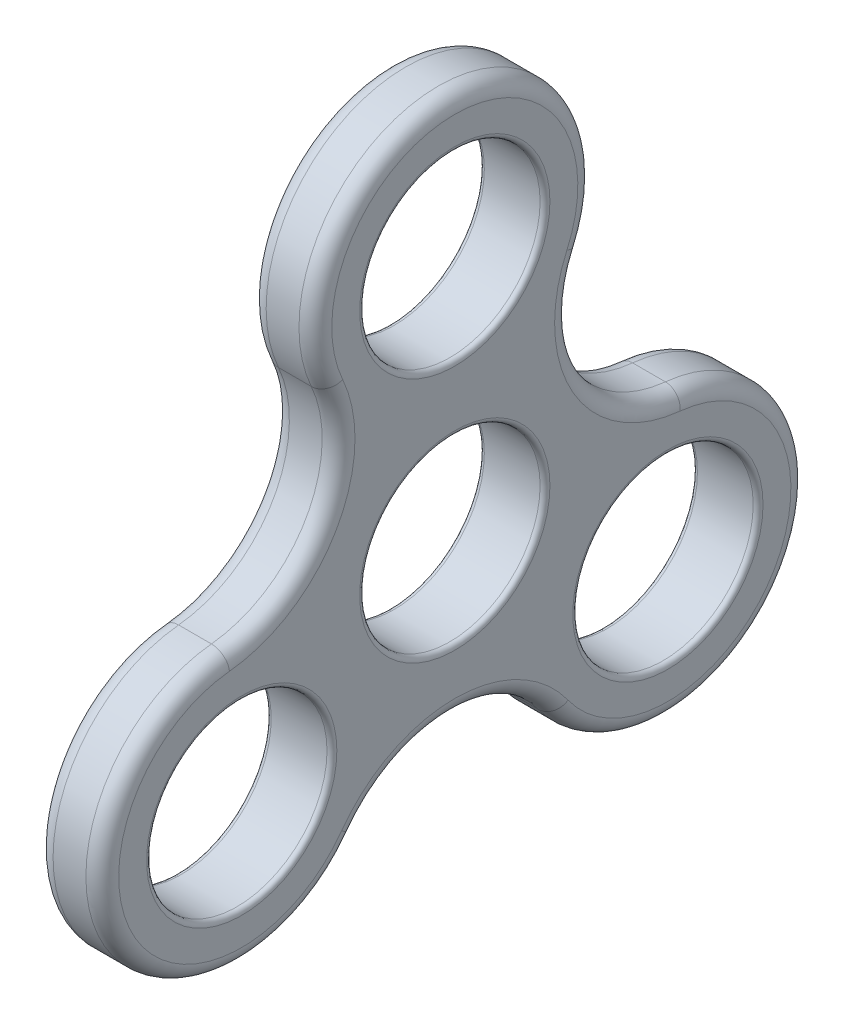
ISO-10303-21;
HEADER;
FILE_DESCRIPTION(('STEP AP214'),'2;1');
FILE_NAME('part.step','',(''),(''),'','','');
FILE_SCHEMA(('AUTOMOTIVE_DESIGN { 1 0 10303 214 1 1 1 1 }'));
ENDSEC;
DATA;
#1=APPLICATION_CONTEXT('core data for automotive mechanical design processes');
#2=APPLICATION_PROTOCOL_DEFINITION('international standard','automotive_design',2000,#1);
#3=PRODUCT_CONTEXT('',#1,'mechanical');
#4=PRODUCT('Part','Part','',(#3));
#5=PRODUCT_RELATED_PRODUCT_CATEGORY('part','',(#4));
#6=PRODUCT_DEFINITION_FORMATION('','',#4);
#7=PRODUCT_DEFINITION_CONTEXT('part definition',#1,'design');
#8=PRODUCT_DEFINITION('design','',#6,#7);
#9=PRODUCT_DEFINITION_SHAPE('','',#8);
#10=(LENGTH_UNIT() NAMED_UNIT(*) SI_UNIT(.MILLI.,.METRE.));
#11=(NAMED_UNIT(*) PLANE_ANGLE_UNIT() SI_UNIT($,.RADIAN.));
#12=(NAMED_UNIT(*) SI_UNIT($,.STERADIAN.) SOLID_ANGLE_UNIT());
#13=UNCERTAINTY_MEASURE_WITH_UNIT(LENGTH_MEASURE(1.E-05),#10,'distance_accuracy_value','');
#14=(GEOMETRIC_REPRESENTATION_CONTEXT(3) GLOBAL_UNCERTAINTY_ASSIGNED_CONTEXT((#13)) GLOBAL_UNIT_ASSIGNED_CONTEXT((#10,
#11,#12)) REPRESENTATION_CONTEXT('',''));
#15=CARTESIAN_POINT('',(0.,0.,0.));
#16=DIRECTION('',(0.,0.,1.));
#17=DIRECTION('',(1.,0.,0.));
#18=AXIS2_PLACEMENT_3D('',#15,#16,#17);
#19=CARTESIAN_POINT('',(4.,30.,0.));
#20=DIRECTION('',(-1.,0.,0.));
#21=DIRECTION('',(0.,0.,1.));
#22=AXIS2_PLACEMENT_3D('',#19,#20,#21);
#23=CYLINDRICAL_SURFACE('',#22,17.);
#24=DIRECTION('',(-1.,0.,0.));
#25=VECTOR('',#24,1.);
#26=CARTESIAN_POINT('',(4.,23.0091595120096,-15.4960688328193));
#27=LINE('',#26,#25);
#28=CARTESIAN_POINT('',(2.,23.0091595120096,-15.4960688328193));
#29=VERTEX_POINT('',#28);
#30=CARTESIAN_POINT('',(-2.,23.0091595120096,-15.4960688328193));
#31=VERTEX_POINT('',#30);
#32=EDGE_CURVE('E374',#29,#31,#27,.T.);
#33=ORIENTED_EDGE('',*,*,#32,.T.);
#34=CARTESIAN_POINT('',(-2.,30.,0.));
#35=DIRECTION('',(1.,0.,0.));
#36=DIRECTION('',(0.,0.,-1.));
#37=AXIS2_PLACEMENT_3D('',#34,#35,#36);
#38=CIRCLE('',#37,17.);
#39=CARTESIAN_POINT('',(-2.,23.0091595120093,15.4960688328192));
#40=VERTEX_POINT('',#39);
#41=EDGE_CURVE('E148',#31,#40,#38,.T.);
#42=ORIENTED_EDGE('',*,*,#41,.T.);
#43=DIRECTION('',(-1.,0.,0.));
#44=VECTOR('',#43,1.);
#45=CARTESIAN_POINT('',(4.,23.0091595120093,15.4960688328192));
#46=LINE('',#45,#44);
#47=CARTESIAN_POINT('',(2.,23.0091595120093,15.4960688328192));
#48=VERTEX_POINT('',#47);
#49=EDGE_CURVE('E130',#48,#40,#46,.T.);
#50=ORIENTED_EDGE('',*,*,#49,.F.);
#51=CARTESIAN_POINT('',(2.,30.,0.));
#52=DIRECTION('',(1.,0.,0.));
#53=DIRECTION('',(0.,0.,-1.));
#54=AXIS2_PLACEMENT_3D('',#51,#52,#53);
#55=CIRCLE('',#54,17.);
#56=EDGE_CURVE('E145',#48,#29,#55,.F.);
#57=ORIENTED_EDGE('',*,*,#56,.T.);
#58=EDGE_LOOP('',(#33,#42,#50,#57));
#59=FACE_BOUND('',#58,.T.);
#60=ADVANCED_FACE('F37',(#59),#23,.T.);
#61=CARTESIAN_POINT('',(4.,16.8407708461351,29.1690707441302));
#62=DIRECTION('',(-1.,0.,0.));
#63=DIRECTION('',(0.,0.,1.));
#64=AXIS2_PLACEMENT_3D('',#61,#62,#63);
#65=CYLINDRICAL_SURFACE('',#64,15.);
#66=ORIENTED_EDGE('',*,*,#49,.T.);
#67=CARTESIAN_POINT('',(-2.,16.8407708461351,29.1690707441302));
#68=DIRECTION('',(1.,0.,0.));
#69=DIRECTION('',(0.,0.,-1.));
#70=AXIS2_PLACEMENT_3D('',#67,#68,#69);
#71=CIRCLE('',#70,15.);
#72=CARTESIAN_POINT('',(-2.,1.91540951200975,27.6745510735374));
#73=VERTEX_POINT('',#72);
#74=EDGE_CURVE('E137',#40,#73,#71,.F.);
#75=ORIENTED_EDGE('',*,*,#74,.T.);
#76=DIRECTION('',(-1.,0.,0.));
#77=VECTOR('',#76,1.);
#78=CARTESIAN_POINT('',(4.,1.91540951200975,27.6745510735374));
#79=LINE('',#78,#77);
#80=CARTESIAN_POINT('',(2.,1.91540951200975,27.6745510735374));
#81=VERTEX_POINT('',#80);
#82=EDGE_CURVE('E132',#81,#73,#79,.T.);
#83=ORIENTED_EDGE('',*,*,#82,.F.);
#84=CARTESIAN_POINT('',(2.,16.8407708461351,29.1690707441302));
#85=DIRECTION('',(1.,0.,0.));
#86=DIRECTION('',(0.,0.,-1.));
#87=AXIS2_PLACEMENT_3D('',#84,#85,#86);
#88=CIRCLE('',#87,15.);
#89=EDGE_CURVE('E127',#81,#48,#88,.T.);
#90=ORIENTED_EDGE('',*,*,#89,.T.);
#91=EDGE_LOOP('',(#66,#75,#83,#90));
#92=FACE_BOUND('',#91,.T.);
#93=ADVANCED_FACE('F129',(#92),#65,.F.);
#94=CARTESIAN_POINT('',(4.,-14.9999999999995,25.9807621135322));
#95=DIRECTION('',(-1.,0.,0.));
#96=DIRECTION('',(0.,0.,1.));
#97=AXIS2_PLACEMENT_3D('',#94,#95,#96);
#98=CYLINDRICAL_SURFACE('',#97,17.0000000000003);
#99=ORIENTED_EDGE('',*,*,#82,.T.);
#100=CARTESIAN_POINT('',(-2.,-14.9999999999995,25.9807621135322));
#101=DIRECTION('',(1.,0.,0.));
#102=DIRECTION('',(0.,0.,-1.));
#103=AXIS2_PLACEMENT_3D('',#100,#101,#102);
#104=CIRCLE('',#103,17.0000000000003);
#105=CARTESIAN_POINT('',(-2.,-24.9245690240179,12.1784822407177));
#106=VERTEX_POINT('',#105);
#107=EDGE_CURVE('E348',#73,#106,#104,.T.);
#108=ORIENTED_EDGE('',*,*,#107,.T.);
#109=DIRECTION('',(-1.,0.,0.));
#110=VECTOR('',#109,1.);
#111=CARTESIAN_POINT('',(4.,-24.9245690240179,12.1784822407177));
#112=LINE('',#111,#110);
#113=CARTESIAN_POINT('',(2.,-24.9245690240179,12.1784822407177));
#114=VERTEX_POINT('',#113);
#115=EDGE_CURVE('E352',#114,#106,#112,.T.);
#116=ORIENTED_EDGE('',*,*,#115,.F.);
#117=CARTESIAN_POINT('',(2.,-14.9999999999995,25.9807621135322));
#118=DIRECTION('',(1.,0.,0.));
#119=DIRECTION('',(0.,0.,-1.));
#120=AXIS2_PLACEMENT_3D('',#117,#118,#119);
#121=CIRCLE('',#120,17.0000000000003);
#122=EDGE_CURVE('E351',#114,#81,#121,.F.);
#123=ORIENTED_EDGE('',*,*,#122,.T.);
#124=EDGE_LOOP('',(#99,#108,#116,#123));
#125=FACE_BOUND('',#124,.T.);
#126=ADVANCED_FACE('F238',(#125),#98,.T.);
#127=CARTESIAN_POINT('',(4.,-33.6815416922692,-6.76108474761961E-13));
#128=DIRECTION('',(-1.,0.,0.));
#129=DIRECTION('',(0.,0.,1.));
#130=AXIS2_PLACEMENT_3D('',#127,#128,#129);
#131=CYLINDRICAL_SURFACE('',#130,15.);
#132=ORIENTED_EDGE('',*,*,#115,.T.);
#133=CARTESIAN_POINT('',(-2.,-33.6815416922692,-6.76108474761961E-13));
#134=DIRECTION('',(1.,0.,0.));
#135=DIRECTION('',(0.,0.,-1.));
#136=AXIS2_PLACEMENT_3D('',#133,#134,#135);
#137=CIRCLE('',#136,15.);
#138=CARTESIAN_POINT('',(-2.,-24.924569024018,-12.1784822407184));
#139=VERTEX_POINT('',#138);
#140=EDGE_CURVE('E411',#106,#139,#137,.F.);
#141=ORIENTED_EDGE('',*,*,#140,.T.);
#142=DIRECTION('',(-1.,0.,0.));
#143=VECTOR('',#142,1.);
#144=CARTESIAN_POINT('',(4.,-24.924569024018,-12.1784822407184));
#145=LINE('',#144,#143);
#146=CARTESIAN_POINT('',(2.,-24.924569024018,-12.1784822407184));
#147=VERTEX_POINT('',#146);
#148=EDGE_CURVE('E382',#147,#139,#145,.T.);
#149=ORIENTED_EDGE('',*,*,#148,.F.);
#150=CARTESIAN_POINT('',(2.,-33.6815416922692,-6.76108474761961E-13));
#151=DIRECTION('',(1.,0.,0.));
#152=DIRECTION('',(0.,0.,-1.));
#153=AXIS2_PLACEMENT_3D('',#150,#151,#152);
#154=CIRCLE('',#153,15.);
#155=EDGE_CURVE('E409',#147,#114,#154,.T.);
#156=ORIENTED_EDGE('',*,*,#155,.T.);
#157=EDGE_LOOP('',(#132,#141,#149,#156));
#158=FACE_BOUND('',#157,.T.);
#159=ADVANCED_FACE('F338',(#158),#131,.F.);
#160=CARTESIAN_POINT('',(4.,-14.9999999999989,-25.9807621135332));
#161=DIRECTION('',(-1.,0.,0.));
#162=DIRECTION('',(0.,0.,1.));
#163=AXIS2_PLACEMENT_3D('',#160,#161,#162);
#164=CYLINDRICAL_SURFACE('',#163,17.0000000000011);
#165=ORIENTED_EDGE('',*,*,#148,.T.);
#166=CARTESIAN_POINT('',(-2.,-14.9999999999989,-25.9807621135332));
#167=DIRECTION('',(1.,0.,0.));
#168=DIRECTION('',(0.,0.,-1.));
#169=AXIS2_PLACEMENT_3D('',#166,#167,#168);
#170=CIRCLE('',#169,17.0000000000011);
#171=CARTESIAN_POINT('',(-2.,1.91540951201094,-27.6745510735381));
#172=VERTEX_POINT('',#171);
#173=EDGE_CURVE('E407',#139,#172,#170,.T.);
#174=ORIENTED_EDGE('',*,*,#173,.T.);
#175=DIRECTION('',(-1.,0.,0.));
#176=VECTOR('',#175,1.);
#177=CARTESIAN_POINT('',(4.,1.91540951201094,-27.6745510735381));
#178=LINE('',#177,#176);
#179=CARTESIAN_POINT('',(2.,1.91540951201094,-27.6745510735381));
#180=VERTEX_POINT('',#179);
#181=EDGE_CURVE('E378',#180,#172,#178,.T.);
#182=ORIENTED_EDGE('',*,*,#181,.F.);
#183=CARTESIAN_POINT('',(2.,-14.9999999999989,-25.9807621135332));
#184=DIRECTION('',(1.,0.,0.));
#185=DIRECTION('',(0.,0.,-1.));
#186=AXIS2_PLACEMENT_3D('',#183,#184,#185);
#187=CIRCLE('',#186,17.0000000000011);
#188=EDGE_CURVE('E405',#180,#147,#187,.F.);
#189=ORIENTED_EDGE('',*,*,#188,.T.);
#190=EDGE_LOOP('',(#165,#174,#182,#189));
#191=FACE_BOUND('',#190,.T.);
#192=ADVANCED_FACE('F331',(#191),#164,.T.);
#193=CARTESIAN_POINT('',(4.,-14.9999999999989,-25.9807621135332));
#194=DIRECTION('',(-1.,0.,0.));
#195=DIRECTION('',(0.,0.,1.));
#196=AXIS2_PLACEMENT_3D('',#193,#194,#195);
#197=CYLINDRICAL_SURFACE('',#196,11.0000000000012);
#198=CARTESIAN_POINT('',(-3.4,-14.9999999999989,-25.9807621135332));
#199=DIRECTION('',(1.,0.,0.));
#200=DIRECTION('',(0.,0.,-1.));
#201=AXIS2_PLACEMENT_3D('',#198,#199,#200);
#202=CIRCLE('',#201,11.0000000000012);
#203=CARTESIAN_POINT('',(-3.4,-14.9999999999989,-36.9807621135344));
#204=VERTEX_POINT('',#203);
#205=EDGE_CURVE('E211',#204,#204,#202,.F.);
#206=ORIENTED_EDGE('',*,*,#205,.T.);
#207=EDGE_LOOP('',(#206));
#208=FACE_BOUND('',#207,.T.);
#209=CARTESIAN_POINT('',(3.4,-14.9999999999989,-25.9807621135332));
#210=DIRECTION('',(1.,0.,0.));
#211=DIRECTION('',(0.,0.,-1.));
#212=AXIS2_PLACEMENT_3D('',#209,#210,#211);
#213=CIRCLE('',#212,11.0000000000012);
#214=CARTESIAN_POINT('',(3.4,-14.9999999999989,-36.9807621135344));
#215=VERTEX_POINT('',#214);
#216=EDGE_CURVE('E208',#215,#215,#213,.T.);
#217=ORIENTED_EDGE('',*,*,#216,.T.);
#218=EDGE_LOOP('',(#217));
#219=FACE_BOUND('',#218,.T.);
#220=ADVANCED_FACE('F322',(#208,#219),#197,.F.);
#221=CARTESIAN_POINT('',(4.,0.,0.));
#222=DIRECTION('',(-1.,0.,0.));
#223=DIRECTION('',(0.,0.,1.));
#224=AXIS2_PLACEMENT_3D('',#221,#222,#223);
#225=CYLINDRICAL_SURFACE('',#224,11.);
#226=CARTESIAN_POINT('',(-3.4,0.,0.));
#227=DIRECTION('',(1.,0.,0.));
#228=DIRECTION('',(0.,0.,-1.));
#229=AXIS2_PLACEMENT_3D('',#226,#227,#228);
#230=CIRCLE('',#229,11.);
#231=CARTESIAN_POINT('',(-3.4,0.,-11.));
#232=VERTEX_POINT('',#231);
#233=EDGE_CURVE('E217',#232,#232,#230,.F.);
#234=ORIENTED_EDGE('',*,*,#233,.T.);
#235=EDGE_LOOP('',(#234));
#236=FACE_BOUND('',#235,.T.);
#237=CARTESIAN_POINT('',(3.4,0.,0.));
#238=DIRECTION('',(1.,0.,0.));
#239=DIRECTION('',(0.,0.,-1.));
#240=AXIS2_PLACEMENT_3D('',#237,#238,#239);
#241=CIRCLE('',#240,11.);
#242=CARTESIAN_POINT('',(3.4,0.,-11.));
#243=VERTEX_POINT('',#242);
#244=EDGE_CURVE('E214',#243,#243,#241,.T.);
#245=ORIENTED_EDGE('',*,*,#244,.T.);
#246=EDGE_LOOP('',(#245));
#247=FACE_BOUND('',#246,.T.);
#248=ADVANCED_FACE('F320',(#236,#247),#225,.F.);
#249=CARTESIAN_POINT('',(4.,16.8407708461358,-29.1690707441305));
#250=DIRECTION('',(-1.,0.,0.));
#251=DIRECTION('',(0.,0.,1.));
#252=AXIS2_PLACEMENT_3D('',#249,#250,#251);
#253=CYLINDRICAL_SURFACE('',#252,15.);
#254=ORIENTED_EDGE('',*,*,#181,.T.);
#255=CARTESIAN_POINT('',(-2.,16.8407708461358,-29.1690707441305));
#256=DIRECTION('',(1.,0.,0.));
#257=DIRECTION('',(0.,0.,-1.));
#258=AXIS2_PLACEMENT_3D('',#255,#256,#257);
#259=CIRCLE('',#258,15.);
#260=EDGE_CURVE('E403',#172,#31,#259,.F.);
#261=ORIENTED_EDGE('',*,*,#260,.T.);
#262=ORIENTED_EDGE('',*,*,#32,.F.);
#263=CARTESIAN_POINT('',(2.,16.8407708461358,-29.1690707441305));
#264=DIRECTION('',(1.,0.,0.));
#265=DIRECTION('',(0.,0.,-1.));
#266=AXIS2_PLACEMENT_3D('',#263,#264,#265);
#267=CIRCLE('',#266,15.);
#268=EDGE_CURVE('E401',#29,#180,#267,.T.);
#269=ORIENTED_EDGE('',*,*,#268,.T.);
#270=EDGE_LOOP('',(#254,#261,#262,#269));
#271=FACE_BOUND('',#270,.T.);
#272=ADVANCED_FACE('F245',(#271),#253,.F.);
#273=CARTESIAN_POINT('',(4.,30.,0.));
#274=DIRECTION('',(-1.,0.,0.));
#275=DIRECTION('',(0.,0.,1.));
#276=AXIS2_PLACEMENT_3D('',#273,#274,#275);
#277=CYLINDRICAL_SURFACE('',#276,11.);
#278=CARTESIAN_POINT('',(-3.4,30.,0.));
#279=DIRECTION('',(1.,0.,0.));
#280=DIRECTION('',(0.,0.,-1.));
#281=AXIS2_PLACEMENT_3D('',#278,#279,#280);
#282=CIRCLE('',#281,11.);
#283=CARTESIAN_POINT('',(-3.4,30.,-11.));
#284=VERTEX_POINT('',#283);
#285=EDGE_CURVE('E11',#284,#284,#282,.F.);
#286=ORIENTED_EDGE('',*,*,#285,.T.);
#287=EDGE_LOOP('',(#286));
#288=FACE_BOUND('',#287,.T.);
#289=CARTESIAN_POINT('',(3.4,30.,0.));
#290=DIRECTION('',(1.,0.,0.));
#291=DIRECTION('',(0.,0.,-1.));
#292=AXIS2_PLACEMENT_3D('',#289,#290,#291);
#293=CIRCLE('',#292,11.);
#294=CARTESIAN_POINT('',(3.4,30.,-11.));
#295=VERTEX_POINT('',#294);
#296=EDGE_CURVE('E45',#295,#295,#293,.T.);
#297=ORIENTED_EDGE('',*,*,#296,.T.);
#298=EDGE_LOOP('',(#297));
#299=FACE_BOUND('',#298,.T.);
#300=ADVANCED_FACE('F222',(#288,#299),#277,.F.);
#301=CARTESIAN_POINT('',(4.,-14.9999999999995,25.9807621135322));
#302=DIRECTION('',(-1.,0.,0.));
#303=DIRECTION('',(0.,0.,1.));
#304=AXIS2_PLACEMENT_3D('',#301,#302,#303);
#305=CYLINDRICAL_SURFACE('',#304,11.0000000000006);
#306=CARTESIAN_POINT('',(-3.4,-14.9999999999995,25.9807621135322));
#307=DIRECTION('',(1.,0.,0.));
#308=DIRECTION('',(0.,0.,-1.));
#309=AXIS2_PLACEMENT_3D('',#306,#307,#308);
#310=CIRCLE('',#309,11.0000000000006);
#311=CARTESIAN_POINT('',(-3.4,-14.9999999999995,14.9807621135316));
#312=VERTEX_POINT('',#311);
#313=EDGE_CURVE('E193',#312,#312,#310,.F.);
#314=ORIENTED_EDGE('',*,*,#313,.T.);
#315=EDGE_LOOP('',(#314));
#316=FACE_BOUND('',#315,.T.);
#317=CARTESIAN_POINT('',(3.4,-14.9999999999995,25.9807621135322));
#318=DIRECTION('',(1.,0.,0.));
#319=DIRECTION('',(0.,0.,-1.));
#320=AXIS2_PLACEMENT_3D('',#317,#318,#319);
#321=CIRCLE('',#320,11.0000000000006);
#322=CARTESIAN_POINT('',(3.4,-14.9999999999995,14.9807621135316));
#323=VERTEX_POINT('',#322);
#324=EDGE_CURVE('E190',#323,#323,#321,.T.);
#325=ORIENTED_EDGE('',*,*,#324,.T.);
#326=EDGE_LOOP('',(#325));
#327=FACE_BOUND('',#326,.T.);
#328=ADVANCED_FACE('F244',(#316,#327),#305,.F.);
#329=CARTESIAN_POINT('',(4.,0.,0.));
#330=DIRECTION('',(1.,0.,0.));
#331=DIRECTION('',(0.,0.,-1.));
#332=AXIS2_PLACEMENT_3D('',#329,#330,#331);
#333=PLANE('',#332);
#334=CARTESIAN_POINT('',(4.,-14.9999999999995,25.9807621135322));
#335=DIRECTION('',(1.,0.,0.));
#336=DIRECTION('',(0.,0.,-1.));
#337=AXIS2_PLACEMENT_3D('',#334,#335,#336);
#338=CIRCLE('',#337,11.6000000000006);
#339=CARTESIAN_POINT('',(4.,-14.9999999999995,14.3807621135316));
#340=VERTEX_POINT('',#339);
#341=EDGE_CURVE('E205',#340,#340,#338,.F.);
#342=ORIENTED_EDGE('',*,*,#341,.T.);
#343=EDGE_LOOP('',(#342));
#344=FACE_BOUND('',#343,.T.);
#345=CARTESIAN_POINT('',(4.,-14.9999999999989,-25.9807621135332));
#346=DIRECTION('',(1.,0.,0.));
#347=DIRECTION('',(0.,0.,-1.));
#348=AXIS2_PLACEMENT_3D('',#345,#346,#347);
#349=CIRCLE('',#348,11.6000000000012);
#350=CARTESIAN_POINT('',(4.,-14.9999999999989,-37.5807621135344));
#351=VERTEX_POINT('',#350);
#352=EDGE_CURVE('E202',#351,#351,#349,.F.);
#353=ORIENTED_EDGE('',*,*,#352,.T.);
#354=EDGE_LOOP('',(#353));
#355=FACE_BOUND('',#354,.T.);
#356=CARTESIAN_POINT('',(4.,0.,0.));
#357=DIRECTION('',(1.,0.,0.));
#358=DIRECTION('',(0.,0.,-1.));
#359=AXIS2_PLACEMENT_3D('',#356,#357,#358);
#360=CIRCLE('',#359,11.6);
#361=CARTESIAN_POINT('',(4.,0.,-11.6));
#362=VERTEX_POINT('',#361);
#363=EDGE_CURVE('E199',#362,#362,#360,.F.);
#364=ORIENTED_EDGE('',*,*,#363,.T.);
#365=EDGE_LOOP('',(#364));
#366=FACE_BOUND('',#365,.T.);
#367=CARTESIAN_POINT('',(4.,30.,0.));
#368=DIRECTION('',(1.,0.,0.));
#369=DIRECTION('',(0.,0.,-1.));
#370=AXIS2_PLACEMENT_3D('',#367,#368,#369);
#371=CIRCLE('',#370,11.6);
#372=CARTESIAN_POINT('',(4.,30.,-11.6));
#373=VERTEX_POINT('',#372);
#374=EDGE_CURVE('E196',#373,#373,#371,.F.);
#375=ORIENTED_EDGE('',*,*,#374,.T.);
#376=EDGE_LOOP('',(#375));
#377=FACE_BOUND('',#376,.T.);
#378=CARTESIAN_POINT('',(4.,16.8407708461358,-29.1690707441305));
#379=DIRECTION('',(1.,0.,0.));
#380=DIRECTION('',(0.,0.,-1.));
#381=AXIS2_PLACEMENT_3D('',#378,#379,#380);
#382=CIRCLE('',#381,17.);
#383=CARTESIAN_POINT('',(4.,-0.0746386658721831,-27.4752817841258));
#384=VERTEX_POINT('',#383);
#385=CARTESIAN_POINT('',(4.,23.8316113341261,-13.6730019113112));
#386=VERTEX_POINT('',#385);
#387=EDGE_CURVE('E52',#384,#386,#382,.F.);
#388=ORIENTED_EDGE('',*,*,#387,.T.);
#389=CARTESIAN_POINT('',(4.,30.,0.));
#390=DIRECTION('',(1.,0.,0.));
#391=DIRECTION('',(0.,0.,-1.));
#392=AXIS2_PLACEMENT_3D('',#389,#390,#391);
#393=CIRCLE('',#392,15.);
#394=CARTESIAN_POINT('',(4.,23.8316113341258,13.673001911311));
#395=VERTEX_POINT('',#394);
#396=EDGE_CURVE('E138',#386,#395,#393,.T.);
#397=ORIENTED_EDGE('',*,*,#396,.T.);
#398=CARTESIAN_POINT('',(4.,16.8407708461351,29.1690707441302));
#399=DIRECTION('',(1.,0.,0.));
#400=DIRECTION('',(0.,0.,-1.));
#401=AXIS2_PLACEMENT_3D('',#398,#399,#400);
#402=CIRCLE('',#401,17.);
#403=CARTESIAN_POINT('',(4.,-0.074638665873869,27.475281784125));
#404=VERTEX_POINT('',#403);
#405=EDGE_CURVE('E159',#395,#404,#402,.F.);
#406=ORIENTED_EDGE('',*,*,#405,.T.);
#407=CARTESIAN_POINT('',(4.,-14.9999999999995,25.9807621135322));
#408=DIRECTION('',(1.,0.,0.));
#409=DIRECTION('',(0.,0.,-1.));
#410=AXIS2_PLACEMENT_3D('',#407,#408,#409);
#411=CIRCLE('',#410,15.0000000000003);
#412=CARTESIAN_POINT('',(4.,-23.7569726682511,13.8022798728134));
#413=VERTEX_POINT('',#412);
#414=EDGE_CURVE('E415',#404,#413,#411,.T.);
#415=ORIENTED_EDGE('',*,*,#414,.T.);
#416=CARTESIAN_POINT('',(4.,-33.6815416922692,-6.76108474761961E-13));
#417=DIRECTION('',(1.,0.,0.));
#418=DIRECTION('',(0.,0.,-1.));
#419=AXIS2_PLACEMENT_3D('',#416,#417,#418);
#420=CIRCLE('',#419,17.);
#421=CARTESIAN_POINT('',(4.,-23.7569726682506,-13.8022798728148));
#422=VERTEX_POINT('',#421);
#423=EDGE_CURVE('E417',#413,#422,#420,.F.);
#424=ORIENTED_EDGE('',*,*,#423,.T.);
#425=CARTESIAN_POINT('',(4.,-14.9999999999989,-25.9807621135332));
#426=DIRECTION('',(1.,0.,0.));
#427=DIRECTION('',(0.,0.,-1.));
#428=AXIS2_PLACEMENT_3D('',#425,#426,#427);
#429=CIRCLE('',#428,15.0000000000011);
#430=EDGE_CURVE('E57',#422,#384,#429,.T.);
#431=ORIENTED_EDGE('',*,*,#430,.T.);
#432=EDGE_LOOP('',(#388,#397,#406,#415,#424,#431));
#433=FACE_BOUND('',#432,.T.);
#434=ADVANCED_FACE('F432',(#344,#355,#366,#377,#433),#333,.T.);
#435=CARTESIAN_POINT('',(-4.,0.,0.));
#436=DIRECTION('',(1.,0.,0.));
#437=DIRECTION('',(0.,0.,-1.));
#438=AXIS2_PLACEMENT_3D('',#435,#436,#437);
#439=PLANE('',#438);
#440=CARTESIAN_POINT('',(-4.,-14.9999999999995,25.9807621135322));
#441=DIRECTION('',(1.,0.,0.));
#442=DIRECTION('',(0.,0.,-1.));
#443=AXIS2_PLACEMENT_3D('',#440,#441,#442);
#444=CIRCLE('',#443,11.6000000000006);
#445=CARTESIAN_POINT('',(-4.,-14.9999999999995,14.3807621135316));
#446=VERTEX_POINT('',#445);
#447=EDGE_CURVE('E187',#446,#446,#444,.T.);
#448=ORIENTED_EDGE('',*,*,#447,.T.);
#449=EDGE_LOOP('',(#448));
#450=FACE_BOUND('',#449,.T.);
#451=CARTESIAN_POINT('',(-4.,-14.9999999999989,-25.9807621135332));
#452=DIRECTION('',(1.,0.,0.));
#453=DIRECTION('',(0.,0.,-1.));
#454=AXIS2_PLACEMENT_3D('',#451,#452,#453);
#455=CIRCLE('',#454,11.6000000000012);
#456=CARTESIAN_POINT('',(-4.,-14.9999999999989,-37.5807621135344));
#457=VERTEX_POINT('',#456);
#458=EDGE_CURVE('E184',#457,#457,#455,.T.);
#459=ORIENTED_EDGE('',*,*,#458,.T.);
#460=EDGE_LOOP('',(#459));
#461=FACE_BOUND('',#460,.T.);
#462=CARTESIAN_POINT('',(-4.,0.,0.));
#463=DIRECTION('',(1.,0.,0.));
#464=DIRECTION('',(0.,0.,-1.));
#465=AXIS2_PLACEMENT_3D('',#462,#463,#464);
#466=CIRCLE('',#465,11.6);
#467=CARTESIAN_POINT('',(-4.,0.,-11.6));
#468=VERTEX_POINT('',#467);
#469=EDGE_CURVE('E181',#468,#468,#466,.T.);
#470=ORIENTED_EDGE('',*,*,#469,.T.);
#471=EDGE_LOOP('',(#470));
#472=FACE_BOUND('',#471,.T.);
#473=CARTESIAN_POINT('',(-4.,30.,0.));
#474=DIRECTION('',(1.,0.,0.));
#475=DIRECTION('',(0.,0.,-1.));
#476=AXIS2_PLACEMENT_3D('',#473,#474,#475);
#477=CIRCLE('',#476,11.6);
#478=CARTESIAN_POINT('',(-4.,30.,-11.6));
#479=VERTEX_POINT('',#478);
#480=EDGE_CURVE('E178',#479,#479,#477,.T.);
#481=ORIENTED_EDGE('',*,*,#480,.T.);
#482=EDGE_LOOP('',(#481));
#483=FACE_BOUND('',#482,.T.);
#484=CARTESIAN_POINT('',(-4.,16.8407708461351,29.1690707441302));
#485=DIRECTION('',(1.,0.,0.));
#486=DIRECTION('',(0.,0.,-1.));
#487=AXIS2_PLACEMENT_3D('',#484,#485,#486);
#488=CIRCLE('',#487,17.);
#489=CARTESIAN_POINT('',(-4.,-0.0746386658738708,27.475281784125));
#490=VERTEX_POINT('',#489);
#491=CARTESIAN_POINT('',(-4.,23.8316113341258,13.673001911311));
#492=VERTEX_POINT('',#491);
#493=EDGE_CURVE('E365',#490,#492,#488,.T.);
#494=ORIENTED_EDGE('',*,*,#493,.T.);
#495=CARTESIAN_POINT('',(-4.,30.,0.));
#496=DIRECTION('',(1.,0.,0.));
#497=DIRECTION('',(0.,0.,-1.));
#498=AXIS2_PLACEMENT_3D('',#495,#496,#497);
#499=CIRCLE('',#498,15.);
#500=CARTESIAN_POINT('',(-4.,23.8316113341261,-13.6730019113112));
#501=VERTEX_POINT('',#500);
#502=EDGE_CURVE('E398',#492,#501,#499,.F.);
#503=ORIENTED_EDGE('',*,*,#502,.T.);
#504=CARTESIAN_POINT('',(-4.,16.8407708461358,-29.1690707441305));
#505=DIRECTION('',(1.,0.,0.));
#506=DIRECTION('',(0.,0.,-1.));
#507=AXIS2_PLACEMENT_3D('',#504,#505,#506);
#508=CIRCLE('',#507,17.);
#509=CARTESIAN_POINT('',(-4.,-0.0746386658721832,-27.4752817841258));
#510=VERTEX_POINT('',#509);
#511=EDGE_CURVE('E396',#501,#510,#508,.T.);
#512=ORIENTED_EDGE('',*,*,#511,.T.);
#513=CARTESIAN_POINT('',(-4.,-14.9999999999989,-25.9807621135332));
#514=DIRECTION('',(1.,0.,0.));
#515=DIRECTION('',(0.,0.,-1.));
#516=AXIS2_PLACEMENT_3D('',#513,#514,#515);
#517=CIRCLE('',#516,15.0000000000011);
#518=CARTESIAN_POINT('',(-4.,-23.7569726682506,-13.8022798728148));
#519=VERTEX_POINT('',#518);
#520=EDGE_CURVE('E394',#510,#519,#517,.F.);
#521=ORIENTED_EDGE('',*,*,#520,.T.);
#522=CARTESIAN_POINT('',(-4.,-33.6815416922692,-6.76108474761961E-13));
#523=DIRECTION('',(1.,0.,0.));
#524=DIRECTION('',(0.,0.,-1.));
#525=AXIS2_PLACEMENT_3D('',#522,#523,#524);
#526=CIRCLE('',#525,17.);
#527=CARTESIAN_POINT('',(-4.,-23.7569726682511,13.8022798728134));
#528=VERTEX_POINT('',#527);
#529=EDGE_CURVE('E392',#519,#528,#526,.T.);
#530=ORIENTED_EDGE('',*,*,#529,.T.);
#531=CARTESIAN_POINT('',(-4.,-14.9999999999995,25.9807621135322));
#532=DIRECTION('',(1.,0.,0.));
#533=DIRECTION('',(0.,0.,-1.));
#534=AXIS2_PLACEMENT_3D('',#531,#532,#533);
#535=CIRCLE('',#534,15.0000000000003);
#536=EDGE_CURVE('E390',#528,#490,#535,.F.);
#537=ORIENTED_EDGE('',*,*,#536,.T.);
#538=EDGE_LOOP('',(#494,#503,#512,#521,#530,#537));
#539=FACE_BOUND('',#538,.T.);
#540=ADVANCED_FACE('F271',(#450,#461,#472,#483,#539),#439,.F.);
#541=CARTESIAN_POINT('',(-2.,-33.6815416922692,-6.76108474761961E-13));
#542=DIRECTION('',(1.,0.,0.));
#543=DIRECTION('',(0.,0.,-1.));
#544=AXIS2_PLACEMENT_3D('',#541,#542,#543);
#545=TOROIDAL_SURFACE('',#544,17.,2.);
#546=CARTESIAN_POINT('',(-2.,-23.7569726682509,13.8022798728137));
#547=DIRECTION('',(0.,-0.811898816047903,0.58379817788343));
#548=DIRECTION('',(0.,-0.58379817788343,-0.811898816047903));
#549=AXIS2_PLACEMENT_3D('',#546,#547,#548);
#550=CIRCLE('',#549,2.);
#551=EDGE_CURVE('E361',#528,#106,#550,.T.);
#552=ORIENTED_EDGE('',*,*,#551,.F.);
#553=ORIENTED_EDGE('',*,*,#529,.F.);
#554=CARTESIAN_POINT('',(-2.,-23.7569726682506,-13.8022798728148));
#555=DIRECTION('',(0.,-0.81189881604789,-0.583798177883449));
#556=DIRECTION('',(0.,0.583798177883449,-0.81189881604789));
#557=AXIS2_PLACEMENT_3D('',#554,#555,#556);
#558=CIRCLE('',#557,2.);
#559=EDGE_CURVE('E164',#139,#519,#558,.T.);
#560=ORIENTED_EDGE('',*,*,#559,.F.);
#561=ORIENTED_EDGE('',*,*,#140,.F.);
#562=EDGE_LOOP('',(#552,#553,#560,#561));
#563=FACE_BOUND('',#562,.T.);
#564=ADVANCED_FACE('F267',(#563),#545,.T.);
#565=CARTESIAN_POINT('',(-2.,-14.9999999999989,-25.9807621135332));
#566=DIRECTION('',(1.,0.,0.));
#567=DIRECTION('',(0.,0.,-1.));
#568=AXIS2_PLACEMENT_3D('',#565,#566,#567);
#569=TOROIDAL_SURFACE('',#568,15.0000000000011,2.);
#570=ORIENTED_EDGE('',*,*,#559,.T.);
#571=ORIENTED_EDGE('',*,*,#520,.F.);
#572=CARTESIAN_POINT('',(-2.,-0.0746386658721848,-27.4752817841258));
#573=DIRECTION('',(0.,0.0996346447061664,0.995024088941708));
#574=DIRECTION('',(0.,-0.995024088941708,0.0996346447061664));
#575=AXIS2_PLACEMENT_3D('',#572,#573,#574);
#576=CIRCLE('',#575,2.);
#577=EDGE_CURVE('E366',#172,#510,#576,.T.);
#578=ORIENTED_EDGE('',*,*,#577,.F.);
#579=ORIENTED_EDGE('',*,*,#173,.F.);
#580=EDGE_LOOP('',(#570,#571,#578,#579));
#581=FACE_BOUND('',#580,.T.);
#582=ADVANCED_FACE('F263',(#581),#569,.T.);
#583=CARTESIAN_POINT('',(-2.,-14.9999999999995,25.9807621135322));
#584=DIRECTION('',(1.,0.,0.));
#585=DIRECTION('',(0.,0.,-1.));
#586=AXIS2_PLACEMENT_3D('',#583,#584,#585);
#587=TOROIDAL_SURFACE('',#586,15.0000000000003,2.);
#588=ORIENTED_EDGE('',*,*,#551,.T.);
#589=ORIENTED_EDGE('',*,*,#107,.F.);
#590=CARTESIAN_POINT('',(-2.,-0.0746386658735843,27.4752817841251));
#591=DIRECTION('',(0.,0.0996346447061871,-0.995024088941706));
#592=DIRECTION('',(0.,0.995024088941706,0.0996346447061871));
#593=AXIS2_PLACEMENT_3D('',#590,#591,#592);
#594=CIRCLE('',#593,2.);
#595=EDGE_CURVE('E358',#490,#73,#594,.T.);
#596=ORIENTED_EDGE('',*,*,#595,.F.);
#597=ORIENTED_EDGE('',*,*,#536,.F.);
#598=EDGE_LOOP('',(#588,#589,#596,#597));
#599=FACE_BOUND('',#598,.T.);
#600=ADVANCED_FACE('F259',(#599),#587,.T.);
#601=CARTESIAN_POINT('',(-2.,16.8407708461358,-29.1690707441305));
#602=DIRECTION('',(1.,0.,0.));
#603=DIRECTION('',(0.,0.,-1.));
#604=AXIS2_PLACEMENT_3D('',#601,#602,#603);
#605=TOROIDAL_SURFACE('',#604,17.,2.);
#606=ORIENTED_EDGE('',*,*,#577,.T.);
#607=ORIENTED_EDGE('',*,*,#511,.F.);
#608=CARTESIAN_POINT('',(-2.,23.8316113341261,-13.6730019113112));
#609=DIRECTION('',(0.,0.911533460754078,-0.411225911058258));
#610=DIRECTION('',(0.,0.411225911058258,0.911533460754078));
#611=AXIS2_PLACEMENT_3D('',#608,#609,#610);
#612=CIRCLE('',#611,2.);
#613=EDGE_CURVE('E367',#31,#501,#612,.T.);
#614=ORIENTED_EDGE('',*,*,#613,.F.);
#615=ORIENTED_EDGE('',*,*,#260,.F.);
#616=EDGE_LOOP('',(#606,#607,#614,#615));
#617=FACE_BOUND('',#616,.T.);
#618=ADVANCED_FACE('F255',(#617),#605,.T.);
#619=CARTESIAN_POINT('',(-2.,16.8407708461351,29.1690707441302));
#620=DIRECTION('',(1.,0.,0.));
#621=DIRECTION('',(0.,0.,-1.));
#622=AXIS2_PLACEMENT_3D('',#619,#620,#621);
#623=TOROIDAL_SURFACE('',#622,17.,2.);
#624=ORIENTED_EDGE('',*,*,#595,.T.);
#625=ORIENTED_EDGE('',*,*,#74,.F.);
#626=CARTESIAN_POINT('',(-2.,23.8316113341258,13.673001911311));
#627=DIRECTION('',(0.,0.911533460754069,0.411225911058276));
#628=DIRECTION('',(0.,-0.411225911058277,0.911533460754069));
#629=AXIS2_PLACEMENT_3D('',#626,#627,#628);
#630=CIRCLE('',#629,2.);
#631=EDGE_CURVE('E177',#492,#40,#630,.T.);
#632=ORIENTED_EDGE('',*,*,#631,.F.);
#633=ORIENTED_EDGE('',*,*,#493,.F.);
#634=EDGE_LOOP('',(#624,#625,#632,#633));
#635=FACE_BOUND('',#634,.T.);
#636=ADVANCED_FACE('F251',(#635),#623,.T.);
#637=CARTESIAN_POINT('',(-2.,30.,0.));
#638=DIRECTION('',(1.,0.,0.));
#639=DIRECTION('',(0.,0.,-1.));
#640=AXIS2_PLACEMENT_3D('',#637,#638,#639);
#641=TOROIDAL_SURFACE('',#640,15.,2.);
#642=ORIENTED_EDGE('',*,*,#613,.T.);
#643=ORIENTED_EDGE('',*,*,#502,.F.);
#644=ORIENTED_EDGE('',*,*,#631,.T.);
#645=ORIENTED_EDGE('',*,*,#41,.F.);
#646=EDGE_LOOP('',(#642,#643,#644,#645));
#647=FACE_BOUND('',#646,.T.);
#648=ADVANCED_FACE('F247',(#647),#641,.T.);
#649=CARTESIAN_POINT('',(2.,-33.6815416922692,-6.76108474761961E-13));
#650=DIRECTION('',(1.,0.,0.));
#651=DIRECTION('',(0.,0.,-1.));
#652=AXIS2_PLACEMENT_3D('',#649,#650,#651);
#653=TOROIDAL_SURFACE('',#652,17.,2.);
#654=CARTESIAN_POINT('',(2.,-23.7569726682509,13.8022798728137));
#655=DIRECTION('',(0.,-0.811898816047903,0.58379817788343));
#656=DIRECTION('',(0.,-0.58379817788343,-0.811898816047903));
#657=AXIS2_PLACEMENT_3D('',#654,#655,#656);
#658=CIRCLE('',#657,2.);
#659=EDGE_CURVE('E171',#114,#413,#658,.T.);
#660=ORIENTED_EDGE('',*,*,#659,.F.);
#661=ORIENTED_EDGE('',*,*,#155,.F.);
#662=CARTESIAN_POINT('',(2.,-23.7569726682506,-13.8022798728148));
#663=DIRECTION('',(0.,-0.81189881604789,-0.583798177883449));
#664=DIRECTION('',(0.,0.583798177883449,-0.81189881604789));
#665=AXIS2_PLACEMENT_3D('',#662,#663,#664);
#666=CIRCLE('',#665,2.);
#667=EDGE_CURVE('E174',#422,#147,#666,.T.);
#668=ORIENTED_EDGE('',*,*,#667,.F.);
#669=ORIENTED_EDGE('',*,*,#423,.F.);
#670=EDGE_LOOP('',(#660,#661,#668,#669));
#671=FACE_BOUND('',#670,.T.);
#672=ADVANCED_FACE('F250',(#671),#653,.T.);
#673=CARTESIAN_POINT('',(2.,-14.9999999999989,-25.9807621135332));
#674=DIRECTION('',(1.,0.,0.));
#675=DIRECTION('',(0.,0.,-1.));
#676=AXIS2_PLACEMENT_3D('',#673,#674,#675);
#677=TOROIDAL_SURFACE('',#676,15.0000000000011,2.);
#678=ORIENTED_EDGE('',*,*,#667,.T.);
#679=ORIENTED_EDGE('',*,*,#188,.F.);
#680=CARTESIAN_POINT('',(2.,-0.0746386658721831,-27.4752817841258));
#681=DIRECTION('',(0.,0.0996346447061665,0.995024088941708));
#682=DIRECTION('',(0.,-0.995024088941708,0.0996346447061665));
#683=AXIS2_PLACEMENT_3D('',#680,#681,#682);
#684=CIRCLE('',#683,2.);
#685=EDGE_CURVE('E168',#384,#180,#684,.T.);
#686=ORIENTED_EDGE('',*,*,#685,.F.);
#687=ORIENTED_EDGE('',*,*,#430,.F.);
#688=EDGE_LOOP('',(#678,#679,#686,#687));
#689=FACE_BOUND('',#688,.T.);
#690=ADVANCED_FACE('F285',(#689),#677,.T.);
#691=CARTESIAN_POINT('',(2.,-14.9999999999995,25.9807621135322));
#692=DIRECTION('',(1.,0.,0.));
#693=DIRECTION('',(0.,0.,-1.));
#694=AXIS2_PLACEMENT_3D('',#691,#692,#693);
#695=TOROIDAL_SURFACE('',#694,15.0000000000003,2.);
#696=ORIENTED_EDGE('',*,*,#659,.T.);
#697=ORIENTED_EDGE('',*,*,#414,.F.);
#698=CARTESIAN_POINT('',(2.,-0.0746386658735808,27.4752817841251));
#699=DIRECTION('',(0.,0.0996346447061872,-0.995024088941706));
#700=DIRECTION('',(0.,0.995024088941706,0.0996346447061872));
#701=AXIS2_PLACEMENT_3D('',#698,#699,#700);
#702=CIRCLE('',#701,2.);
#703=EDGE_CURVE('E161',#81,#404,#702,.T.);
#704=ORIENTED_EDGE('',*,*,#703,.F.);
#705=ORIENTED_EDGE('',*,*,#122,.F.);
#706=EDGE_LOOP('',(#696,#697,#704,#705));
#707=FACE_BOUND('',#706,.T.);
#708=ADVANCED_FACE('F281',(#707),#695,.T.);
#709=CARTESIAN_POINT('',(2.,16.8407708461358,-29.1690707441305));
#710=DIRECTION('',(1.,0.,0.));
#711=DIRECTION('',(0.,0.,-1.));
#712=AXIS2_PLACEMENT_3D('',#709,#710,#711);
#713=TOROIDAL_SURFACE('',#712,17.,2.);
#714=ORIENTED_EDGE('',*,*,#685,.T.);
#715=ORIENTED_EDGE('',*,*,#268,.F.);
#716=CARTESIAN_POINT('',(2.,23.8316113341261,-13.6730019113112));
#717=DIRECTION('',(0.,0.911533460754078,-0.411225911058258));
#718=DIRECTION('',(0.,0.411225911058258,0.911533460754078));
#719=AXIS2_PLACEMENT_3D('',#716,#717,#718);
#720=CIRCLE('',#719,2.);
#721=EDGE_CURVE('E155',#386,#29,#720,.T.);
#722=ORIENTED_EDGE('',*,*,#721,.F.);
#723=ORIENTED_EDGE('',*,*,#387,.F.);
#724=EDGE_LOOP('',(#714,#715,#722,#723));
#725=FACE_BOUND('',#724,.T.);
#726=ADVANCED_FACE('F278',(#725),#713,.T.);
#727=CARTESIAN_POINT('',(2.,16.8407708461351,29.1690707441302));
#728=DIRECTION('',(1.,0.,0.));
#729=DIRECTION('',(0.,0.,-1.));
#730=AXIS2_PLACEMENT_3D('',#727,#728,#729);
#731=TOROIDAL_SURFACE('',#730,17.,2.);
#732=ORIENTED_EDGE('',*,*,#703,.T.);
#733=ORIENTED_EDGE('',*,*,#405,.F.);
#734=CARTESIAN_POINT('',(2.,23.8316113341258,13.673001911311));
#735=DIRECTION('',(0.,0.911533460754069,0.411225911058277));
#736=DIRECTION('',(0.,-0.411225911058277,0.911533460754069));
#737=AXIS2_PLACEMENT_3D('',#734,#735,#736);
#738=CIRCLE('',#737,2.);
#739=EDGE_CURVE('E153',#48,#395,#738,.T.);
#740=ORIENTED_EDGE('',*,*,#739,.F.);
#741=ORIENTED_EDGE('',*,*,#89,.F.);
#742=EDGE_LOOP('',(#732,#733,#740,#741));
#743=FACE_BOUND('',#742,.T.);
#744=ADVANCED_FACE('F158',(#743),#731,.T.);
#745=CARTESIAN_POINT('',(2.,30.,0.));
#746=DIRECTION('',(1.,0.,0.));
#747=DIRECTION('',(0.,0.,-1.));
#748=AXIS2_PLACEMENT_3D('',#745,#746,#747);
#749=TOROIDAL_SURFACE('',#748,15.,2.);
#750=ORIENTED_EDGE('',*,*,#721,.T.);
#751=ORIENTED_EDGE('',*,*,#56,.F.);
#752=ORIENTED_EDGE('',*,*,#739,.T.);
#753=ORIENTED_EDGE('',*,*,#396,.F.);
#754=EDGE_LOOP('',(#750,#751,#752,#753));
#755=FACE_BOUND('',#754,.T.);
#756=ADVANCED_FACE('F151',(#755),#749,.T.);
#757=CARTESIAN_POINT('',(-3.4,-14.9999999999995,25.9807621135322));
#758=DIRECTION('',(1.,0.,0.));
#759=DIRECTION('',(0.,0.,-1.));
#760=AXIS2_PLACEMENT_3D('',#757,#758,#759);
#761=TOROIDAL_SURFACE('',#760,11.6000000000006,0.6);
#762=ORIENTED_EDGE('',*,*,#313,.F.);
#763=EDGE_LOOP('',(#762));
#764=FACE_BOUND('',#763,.T.);
#765=ORIENTED_EDGE('',*,*,#447,.F.);
#766=EDGE_LOOP('',(#765));
#767=FACE_BOUND('',#766,.T.);
#768=ADVANCED_FACE('F275',(#764,#767),#761,.T.);
#769=CARTESIAN_POINT('',(3.4,-14.9999999999995,25.9807621135322));
#770=DIRECTION('',(1.,0.,0.));
#771=DIRECTION('',(0.,0.,-1.));
#772=AXIS2_PLACEMENT_3D('',#769,#770,#771);
#773=TOROIDAL_SURFACE('',#772,11.6000000000006,0.6);
#774=ORIENTED_EDGE('',*,*,#341,.F.);
#775=EDGE_LOOP('',(#774));
#776=FACE_BOUND('',#775,.T.);
#777=ORIENTED_EDGE('',*,*,#324,.F.);
#778=EDGE_LOOP('',(#777));
#779=FACE_BOUND('',#778,.T.);
#780=ADVANCED_FACE('F295',(#776,#779),#773,.T.);
#781=CARTESIAN_POINT('',(-3.4,-14.9999999999989,-25.9807621135332));
#782=DIRECTION('',(1.,0.,0.));
#783=DIRECTION('',(0.,0.,-1.));
#784=AXIS2_PLACEMENT_3D('',#781,#782,#783);
#785=TOROIDAL_SURFACE('',#784,11.6000000000012,0.6);
#786=ORIENTED_EDGE('',*,*,#205,.F.);
#787=EDGE_LOOP('',(#786));
#788=FACE_BOUND('',#787,.T.);
#789=ORIENTED_EDGE('',*,*,#458,.F.);
#790=EDGE_LOOP('',(#789));
#791=FACE_BOUND('',#790,.T.);
#792=ADVANCED_FACE('F299',(#788,#791),#785,.T.);
#793=CARTESIAN_POINT('',(3.4,-14.9999999999989,-25.9807621135332));
#794=DIRECTION('',(1.,0.,0.));
#795=DIRECTION('',(0.,0.,-1.));
#796=AXIS2_PLACEMENT_3D('',#793,#794,#795);
#797=TOROIDAL_SURFACE('',#796,11.6000000000012,0.6);
#798=ORIENTED_EDGE('',*,*,#352,.F.);
#799=EDGE_LOOP('',(#798));
#800=FACE_BOUND('',#799,.T.);
#801=ORIENTED_EDGE('',*,*,#216,.F.);
#802=EDGE_LOOP('',(#801));
#803=FACE_BOUND('',#802,.T.);
#804=ADVANCED_FACE('F303',(#800,#803),#797,.T.);
#805=CARTESIAN_POINT('',(-3.4,0.,0.));
#806=DIRECTION('',(1.,0.,0.));
#807=DIRECTION('',(0.,0.,-1.));
#808=AXIS2_PLACEMENT_3D('',#805,#806,#807);
#809=TOROIDAL_SURFACE('',#808,11.6,0.6);
#810=ORIENTED_EDGE('',*,*,#233,.F.);
#811=EDGE_LOOP('',(#810));
#812=FACE_BOUND('',#811,.T.);
#813=ORIENTED_EDGE('',*,*,#469,.F.);
#814=EDGE_LOOP('',(#813));
#815=FACE_BOUND('',#814,.T.);
#816=ADVANCED_FACE('F307',(#812,#815),#809,.T.);
#817=CARTESIAN_POINT('',(3.4,0.,0.));
#818=DIRECTION('',(1.,0.,0.));
#819=DIRECTION('',(0.,0.,-1.));
#820=AXIS2_PLACEMENT_3D('',#817,#818,#819);
#821=TOROIDAL_SURFACE('',#820,11.6,0.6);
#822=ORIENTED_EDGE('',*,*,#363,.F.);
#823=EDGE_LOOP('',(#822));
#824=FACE_BOUND('',#823,.T.);
#825=ORIENTED_EDGE('',*,*,#244,.F.);
#826=EDGE_LOOP('',(#825));
#827=FACE_BOUND('',#826,.T.);
#828=ADVANCED_FACE('F230',(#824,#827),#821,.T.);
#829=CARTESIAN_POINT('',(-3.4,30.,0.));
#830=DIRECTION('',(1.,0.,0.));
#831=DIRECTION('',(0.,0.,-1.));
#832=AXIS2_PLACEMENT_3D('',#829,#830,#831);
#833=TOROIDAL_SURFACE('',#832,11.6,0.6);
#834=ORIENTED_EDGE('',*,*,#285,.F.);
#835=EDGE_LOOP('',(#834));
#836=FACE_BOUND('',#835,.T.);
#837=ORIENTED_EDGE('',*,*,#480,.F.);
#838=EDGE_LOOP('',(#837));
#839=FACE_BOUND('',#838,.T.);
#840=ADVANCED_FACE('F225',(#836,#839),#833,.T.);
#841=CARTESIAN_POINT('',(3.4,30.,0.));
#842=DIRECTION('',(1.,0.,0.));
#843=DIRECTION('',(0.,0.,-1.));
#844=AXIS2_PLACEMENT_3D('',#841,#842,#843);
#845=TOROIDAL_SURFACE('',#844,11.6,0.6);
#846=ORIENTED_EDGE('',*,*,#374,.F.);
#847=EDGE_LOOP('',(#846));
#848=FACE_BOUND('',#847,.T.);
#849=ORIENTED_EDGE('',*,*,#296,.F.);
#850=EDGE_LOOP('',(#849));
#851=FACE_BOUND('',#850,.T.);
#852=ADVANCED_FACE('F39',(#848,#851),#845,.T.);
#853=CLOSED_SHELL('',(#60,#93,#126,#159,#192,#220,#248,#272,#300,#328,#434,#540,#564,#582,#600,
#618,#636,#648,#672,#690,#708,#726,#744,#756,#768,#780,#792,#804,#816,#828,#840,#852));
#854=MANIFOLD_SOLID_BREP('B2',#853);
#855=ADVANCED_BREP_SHAPE_REPRESENTATION('',(#18,#854),#14);
#856=SHAPE_DEFINITION_REPRESENTATION(#9,#855);
ENDSEC;
END-ISO-10303-21;
